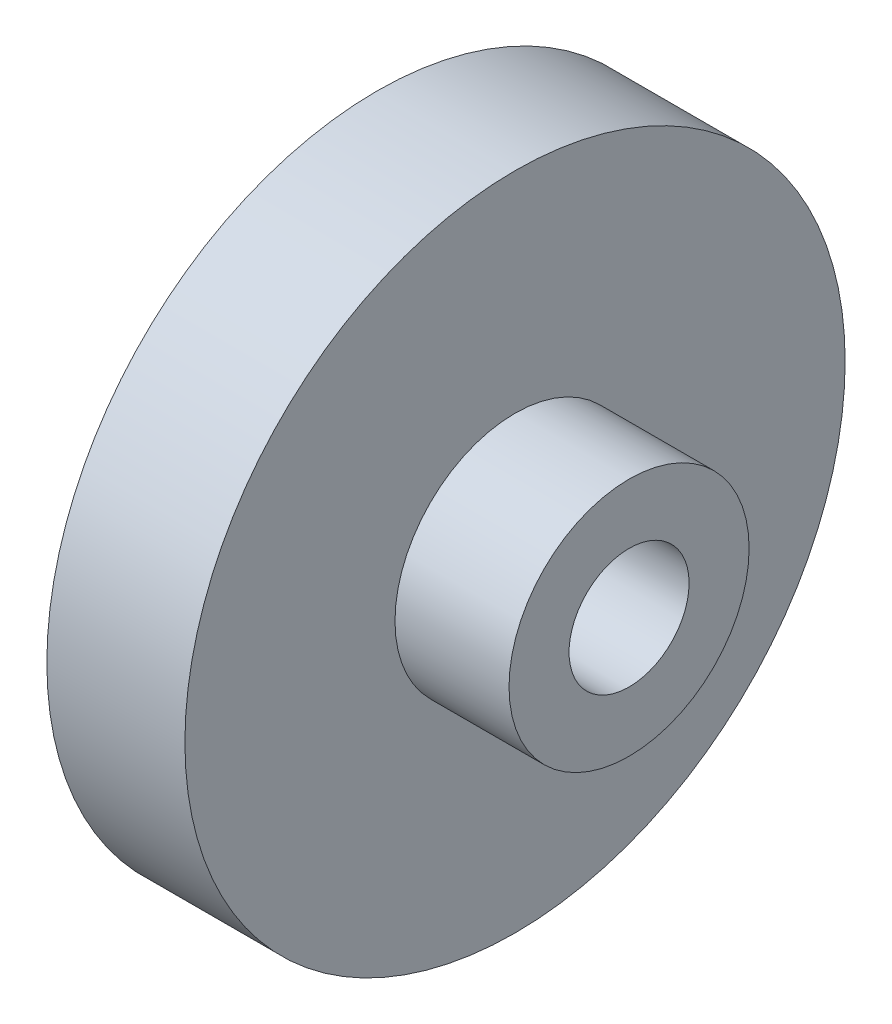
ISO-10303-21;
HEADER;
FILE_DESCRIPTION(('STEP AP214'),'2;1');
FILE_NAME('part.step','',(''),(''),'','','');
FILE_SCHEMA(('AUTOMOTIVE_DESIGN { 1 0 10303 214 1 1 1 1 }'));
ENDSEC;
DATA;
#1=APPLICATION_CONTEXT('core data for automotive mechanical design processes');
#2=APPLICATION_PROTOCOL_DEFINITION('international standard','automotive_design',2000,#1);
#3=PRODUCT_CONTEXT('',#1,'mechanical');
#4=PRODUCT('Part','Part','',(#3));
#5=PRODUCT_RELATED_PRODUCT_CATEGORY('part','',(#4));
#6=PRODUCT_DEFINITION_FORMATION('','',#4);
#7=PRODUCT_DEFINITION_CONTEXT('part definition',#1,'design');
#8=PRODUCT_DEFINITION('design','',#6,#7);
#9=PRODUCT_DEFINITION_SHAPE('','',#8);
#10=(LENGTH_UNIT() NAMED_UNIT(*) SI_UNIT(.MILLI.,.METRE.));
#11=(NAMED_UNIT(*) PLANE_ANGLE_UNIT() SI_UNIT($,.RADIAN.));
#12=(NAMED_UNIT(*) SI_UNIT($,.STERADIAN.) SOLID_ANGLE_UNIT());
#13=UNCERTAINTY_MEASURE_WITH_UNIT(LENGTH_MEASURE(1.E-05),#10,'distance_accuracy_value','');
#14=(GEOMETRIC_REPRESENTATION_CONTEXT(3) GLOBAL_UNCERTAINTY_ASSIGNED_CONTEXT((#13)) GLOBAL_UNIT_ASSIGNED_CONTEXT((#10,
#11,#12)) REPRESENTATION_CONTEXT('',''));
#15=CARTESIAN_POINT('',(0.,0.,0.));
#16=DIRECTION('',(0.,0.,1.));
#17=DIRECTION('',(1.,0.,0.));
#18=AXIS2_PLACEMENT_3D('',#15,#16,#17);
#19=CARTESIAN_POINT('',(0.,0.,0.));
#20=DIRECTION('',(1.,0.,0.));
#21=DIRECTION('',(0.,0.,-1.));
#22=AXIS2_PLACEMENT_3D('',#19,#20,#21);
#23=CYLINDRICAL_SURFACE('',#22,1.);
#24=CARTESIAN_POINT('',(4.2,0.,0.));
#25=DIRECTION('',(1.,0.,0.));
#26=DIRECTION('',(0.,0.,-1.));
#27=AXIS2_PLACEMENT_3D('',#24,#25,#26);
#28=CIRCLE('',#27,1.);
#29=CARTESIAN_POINT('',(4.2,0.,-1.));
#30=VERTEX_POINT('',#29);
#31=EDGE_CURVE('E51',#30,#30,#28,.T.);
#32=ORIENTED_EDGE('',*,*,#31,.T.);
#33=EDGE_LOOP('',(#32));
#34=FACE_BOUND('',#33,.T.);
#35=CARTESIAN_POINT('',(1.5,0.,0.));
#36=DIRECTION('',(-1.,0.,0.));
#37=DIRECTION('',(0.,0.,1.));
#38=AXIS2_PLACEMENT_3D('',#35,#36,#37);
#39=CIRCLE('',#38,1.);
#40=CARTESIAN_POINT('',(1.5,0.,1.));
#41=VERTEX_POINT('',#40);
#42=EDGE_CURVE('E37',#41,#41,#39,.F.);
#43=ORIENTED_EDGE('',*,*,#42,.F.);
#44=EDGE_LOOP('',(#43));
#45=FACE_BOUND('',#44,.T.);
#46=ADVANCED_FACE('F33',(#34,#45),#23,.F.);
#47=CARTESIAN_POINT('',(2.3,0.,0.));
#48=DIRECTION('',(-1.,0.,0.));
#49=DIRECTION('',(0.,0.,1.));
#50=AXIS2_PLACEMENT_3D('',#47,#48,#49);
#51=CYLINDRICAL_SURFACE('',#50,5.5);
#52=CARTESIAN_POINT('',(2.3,0.,0.));
#53=DIRECTION('',(1.,0.,0.));
#54=DIRECTION('',(0.,0.,-1.));
#55=AXIS2_PLACEMENT_3D('',#52,#53,#54);
#56=CIRCLE('',#55,5.5);
#57=CARTESIAN_POINT('',(2.3,0.,-5.5));
#58=VERTEX_POINT('',#57);
#59=EDGE_CURVE('E10',#58,#58,#56,.T.);
#60=ORIENTED_EDGE('',*,*,#59,.F.);
#61=EDGE_LOOP('',(#60));
#62=FACE_BOUND('',#61,.T.);
#63=CARTESIAN_POINT('',(0.,0.,0.));
#64=DIRECTION('',(1.,0.,0.));
#65=DIRECTION('',(0.,0.,-1.));
#66=AXIS2_PLACEMENT_3D('',#63,#64,#65);
#67=CIRCLE('',#66,5.5);
#68=CARTESIAN_POINT('',(0.,0.,-5.5));
#69=VERTEX_POINT('',#68);
#70=EDGE_CURVE('E41',#69,#69,#67,.T.);
#71=ORIENTED_EDGE('',*,*,#70,.T.);
#72=EDGE_LOOP('',(#71));
#73=FACE_BOUND('',#72,.T.);
#74=ADVANCED_FACE('F35',(#62,#73),#51,.T.);
#75=CARTESIAN_POINT('',(2.3,0.,0.));
#76=DIRECTION('',(1.,0.,0.));
#77=DIRECTION('',(0.,0.,-1.));
#78=AXIS2_PLACEMENT_3D('',#75,#76,#77);
#79=PLANE('',#78);
#80=CARTESIAN_POINT('',(2.3,0.,0.));
#81=DIRECTION('',(1.,0.,0.));
#82=DIRECTION('',(0.,0.,-1.));
#83=AXIS2_PLACEMENT_3D('',#80,#81,#82);
#84=CIRCLE('',#83,2.);
#85=CARTESIAN_POINT('',(2.3,0.,2.));
#86=VERTEX_POINT('',#85);
#87=EDGE_CURVE('E48',#86,#86,#84,.T.);
#88=ORIENTED_EDGE('',*,*,#87,.F.);
#89=EDGE_LOOP('',(#88));
#90=FACE_BOUND('',#89,.T.);
#91=ORIENTED_EDGE('',*,*,#59,.T.);
#92=EDGE_LOOP('',(#91));
#93=FACE_BOUND('',#92,.T.);
#94=ADVANCED_FACE('F74',(#90,#93),#79,.T.);
#95=CARTESIAN_POINT('',(0.,0.,0.));
#96=DIRECTION('',(1.,0.,0.));
#97=DIRECTION('',(0.,0.,-1.));
#98=AXIS2_PLACEMENT_3D('',#95,#96,#97);
#99=PLANE('',#98);
#100=CARTESIAN_POINT('',(0.,0.,0.));
#101=DIRECTION('',(-1.,0.,0.));
#102=DIRECTION('',(0.,0.,1.));
#103=AXIS2_PLACEMENT_3D('',#100,#101,#102);
#104=CIRCLE('',#103,4.75);
#105=CARTESIAN_POINT('',(0.,0.,4.75));
#106=VERTEX_POINT('',#105);
#107=EDGE_CURVE('E56',#106,#106,#104,.T.);
#108=ORIENTED_EDGE('',*,*,#107,.F.);
#109=EDGE_LOOP('',(#108));
#110=FACE_BOUND('',#109,.T.);
#111=ORIENTED_EDGE('',*,*,#70,.F.);
#112=EDGE_LOOP('',(#111));
#113=FACE_BOUND('',#112,.T.);
#114=ADVANCED_FACE('F87',(#110,#113),#99,.F.);
#115=CARTESIAN_POINT('',(4.2,0.,0.));
#116=DIRECTION('',(-1.,0.,0.));
#117=DIRECTION('',(0.,0.,1.));
#118=AXIS2_PLACEMENT_3D('',#115,#116,#117);
#119=CYLINDRICAL_SURFACE('',#118,2.);
#120=CARTESIAN_POINT('',(4.2,0.,0.));
#121=DIRECTION('',(1.,0.,0.));
#122=DIRECTION('',(0.,0.,-1.));
#123=AXIS2_PLACEMENT_3D('',#120,#121,#122);
#124=CIRCLE('',#123,2.);
#125=CARTESIAN_POINT('',(4.2,0.,2.));
#126=VERTEX_POINT('',#125);
#127=EDGE_CURVE('E46',#126,#126,#124,.T.);
#128=CARTESIAN_POINT('',(4.2,0.,2.));
#129=CARTESIAN_POINT('',(4.18020833333333,0.,2.));
#130=CARTESIAN_POINT('',(4.16041666666667,0.,2.));
#131=CARTESIAN_POINT('',(4.12083333333333,0.,2.));
#132=CARTESIAN_POINT('',(4.10104166666667,0.,2.));
#133=CARTESIAN_POINT('',(4.06145833333333,0.,2.));
#134=CARTESIAN_POINT('',(4.04166666666667,0.,2.));
#135=CARTESIAN_POINT('',(4.00208333333333,0.,2.));
#136=CARTESIAN_POINT('',(3.98229166666667,0.,2.));
#137=CARTESIAN_POINT('',(3.94270833333333,0.,2.));
#138=CARTESIAN_POINT('',(3.92291666666667,0.,2.));
#139=CARTESIAN_POINT('',(3.88333333333333,0.,2.));
#140=CARTESIAN_POINT('',(3.86354166666667,0.,2.));
#141=CARTESIAN_POINT('',(3.82395833333333,0.,2.));
#142=CARTESIAN_POINT('',(3.80416666666667,0.,2.));
#143=CARTESIAN_POINT('',(3.76458333333333,0.,2.));
#144=CARTESIAN_POINT('',(3.74479166666667,0.,2.));
#145=CARTESIAN_POINT('',(3.70520833333333,0.,2.));
#146=CARTESIAN_POINT('',(3.68541666666667,0.,2.));
#147=CARTESIAN_POINT('',(3.64583333333333,0.,2.));
#148=CARTESIAN_POINT('',(3.62604166666667,0.,2.));
#149=CARTESIAN_POINT('',(3.58645833333333,0.,2.));
#150=CARTESIAN_POINT('',(3.56666666666667,0.,2.));
#151=CARTESIAN_POINT('',(3.52708333333333,0.,2.));
#152=CARTESIAN_POINT('',(3.50729166666667,0.,2.));
#153=CARTESIAN_POINT('',(3.46770833333333,0.,2.));
#154=CARTESIAN_POINT('',(3.44791666666667,0.,2.));
#155=CARTESIAN_POINT('',(3.40833333333333,0.,2.));
#156=CARTESIAN_POINT('',(3.38854166666667,0.,2.));
#157=CARTESIAN_POINT('',(3.34895833333333,0.,2.));
#158=CARTESIAN_POINT('',(3.32916666666667,0.,2.));
#159=CARTESIAN_POINT('',(3.28958333333333,0.,2.));
#160=CARTESIAN_POINT('',(3.26979166666667,0.,2.));
#161=CARTESIAN_POINT('',(3.23020833333333,0.,2.));
#162=CARTESIAN_POINT('',(3.21041666666667,0.,2.));
#163=CARTESIAN_POINT('',(3.17083333333333,0.,2.));
#164=CARTESIAN_POINT('',(3.15104166666667,0.,2.));
#165=CARTESIAN_POINT('',(3.11145833333333,0.,2.));
#166=CARTESIAN_POINT('',(3.09166666666667,0.,2.));
#167=CARTESIAN_POINT('',(3.05208333333333,0.,2.));
#168=CARTESIAN_POINT('',(3.03229166666667,0.,2.));
#169=CARTESIAN_POINT('',(2.99270833333333,0.,2.));
#170=CARTESIAN_POINT('',(2.97291666666667,0.,2.));
#171=CARTESIAN_POINT('',(2.93333333333333,0.,2.));
#172=CARTESIAN_POINT('',(2.91354166666667,0.,2.));
#173=CARTESIAN_POINT('',(2.87395833333333,0.,2.));
#174=CARTESIAN_POINT('',(2.85416666666667,0.,2.));
#175=CARTESIAN_POINT('',(2.81458333333333,0.,2.));
#176=CARTESIAN_POINT('',(2.79479166666667,0.,2.));
#177=CARTESIAN_POINT('',(2.75520833333333,0.,2.));
#178=CARTESIAN_POINT('',(2.73541666666667,0.,2.));
#179=CARTESIAN_POINT('',(2.69583333333333,0.,2.));
#180=CARTESIAN_POINT('',(2.67604166666667,0.,2.));
#181=CARTESIAN_POINT('',(2.63645833333333,0.,2.));
#182=CARTESIAN_POINT('',(2.61666666666667,0.,2.));
#183=CARTESIAN_POINT('',(2.57708333333333,0.,2.));
#184=CARTESIAN_POINT('',(2.55729166666667,0.,2.));
#185=CARTESIAN_POINT('',(2.51770833333333,0.,2.));
#186=CARTESIAN_POINT('',(2.49791666666667,0.,2.));
#187=CARTESIAN_POINT('',(2.45833333333333,0.,2.));
#188=CARTESIAN_POINT('',(2.43854166666667,0.,2.));
#189=CARTESIAN_POINT('',(2.39895833333333,0.,2.));
#190=CARTESIAN_POINT('',(2.37916666666667,0.,2.));
#191=CARTESIAN_POINT('',(2.33958333333333,0.,2.));
#192=CARTESIAN_POINT('',(2.31979166666667,0.,2.));
#193=CARTESIAN_POINT('',(2.3,0.,2.));
#194=B_SPLINE_CURVE_WITH_KNOTS('',3,(#128,#129,#130,#131,#132,#133,#134,#135,#136,#137,#138,
#139,#140,#141,#142,#143,#144,#145,#146,#147,#148,#149,#150,#151,#152,#153,#154,#155,#156,#157,
#158,#159,#160,#161,#162,#163,#164,#165,#166,#167,#168,#169,#170,#171,#172,#173,#174,#175,#176,
#177,#178,#179,#180,#181,#182,#183,#184,#185,#186,#187,#188,#189,#190,#191,#192,#193),
.UNSPECIFIED.,.F.,.F.,(4,2,2,2,2,2,2,2,2,2,2,2,2,2,2,2,2,2,2,2,2,2,2,2,2,2,2,2,2,2,2,2,4),(0.,
0.0593750000000004,0.118750000000001,0.178125,0.237500000000001,0.296875,0.35625,0.415625,0.475,
0.534375,0.59375,0.653125,0.7125,0.771875,0.83125,0.890625,0.95,1.009375,1.06875,1.128125,
1.1875,1.246875,1.30625,1.365625,1.425,1.484375,1.54375,1.603125,1.6625,1.721875,1.78125,
1.840625,1.9),.UNSPECIFIED.);
#195=EDGE_CURVE('BSEAM83',#126,#86,#194,.T.);
#196=ORIENTED_EDGE('',*,*,#127,.F.);
#197=ORIENTED_EDGE('',*,*,#87,.T.);
#198=ORIENTED_EDGE('',*,*,#195,.T.);
#199=ORIENTED_EDGE('',*,*,#195,.F.);
#200=EDGE_LOOP('',(#196,#198,#197,#199));
#201=FACE_BOUND('',#200,.T.);
#202=ADVANCED_FACE('F83',(#201),#119,.T.);
#203=CARTESIAN_POINT('',(4.2,0.,0.));
#204=DIRECTION('',(1.,0.,0.));
#205=DIRECTION('',(0.,0.,-1.));
#206=AXIS2_PLACEMENT_3D('',#203,#204,#205);
#207=PLANE('',#206);
#208=ORIENTED_EDGE('',*,*,#31,.F.);
#209=EDGE_LOOP('',(#208));
#210=FACE_BOUND('',#209,.T.);
#211=ORIENTED_EDGE('',*,*,#127,.T.);
#212=EDGE_LOOP('',(#211));
#213=FACE_BOUND('',#212,.T.);
#214=ADVANCED_FACE('F80',(#210,#213),#207,.T.);
#215=CARTESIAN_POINT('',(1.5,0.,0.));
#216=DIRECTION('',(-1.,0.,0.));
#217=DIRECTION('',(0.,0.,1.));
#218=AXIS2_PLACEMENT_3D('',#215,#216,#217);
#219=PLANE('',#218);
#220=CARTESIAN_POINT('',(1.5,0.,0.));
#221=DIRECTION('',(-1.,0.,0.));
#222=DIRECTION('',(0.,0.,1.));
#223=AXIS2_PLACEMENT_3D('',#220,#221,#222);
#224=CIRCLE('',#223,4.75);
#225=CARTESIAN_POINT('',(1.5,0.,4.75));
#226=VERTEX_POINT('',#225);
#227=EDGE_CURVE('E59',#226,#226,#224,.T.);
#228=ORIENTED_EDGE('',*,*,#227,.T.);
#229=EDGE_LOOP('',(#228));
#230=FACE_BOUND('',#229,.T.);
#231=ORIENTED_EDGE('',*,*,#42,.T.);
#232=EDGE_LOOP('',(#231));
#233=FACE_BOUND('',#232,.T.);
#234=ADVANCED_FACE('F66',(#230,#233),#219,.T.);
#235=CARTESIAN_POINT('',(1.5,0.,0.));
#236=DIRECTION('',(-1.,0.,0.));
#237=DIRECTION('',(0.,0.,1.));
#238=AXIS2_PLACEMENT_3D('',#235,#236,#237);
#239=CYLINDRICAL_SURFACE('',#238,4.75);
#240=ORIENTED_EDGE('',*,*,#227,.F.);
#241=EDGE_LOOP('',(#240));
#242=FACE_BOUND('',#241,.T.);
#243=ORIENTED_EDGE('',*,*,#107,.T.);
#244=EDGE_LOOP('',(#243));
#245=FACE_BOUND('',#244,.T.);
#246=ADVANCED_FACE('F78',(#242,#245),#239,.F.);
#247=CLOSED_SHELL('',(#46,#74,#94,#114,#202,#214,#234,#246));
#248=MANIFOLD_SOLID_BREP('B2',#247);
#249=ADVANCED_BREP_SHAPE_REPRESENTATION('',(#18,#248),#14);
#250=SHAPE_DEFINITION_REPRESENTATION(#9,#249);
ENDSEC;
END-ISO-10303-21;
